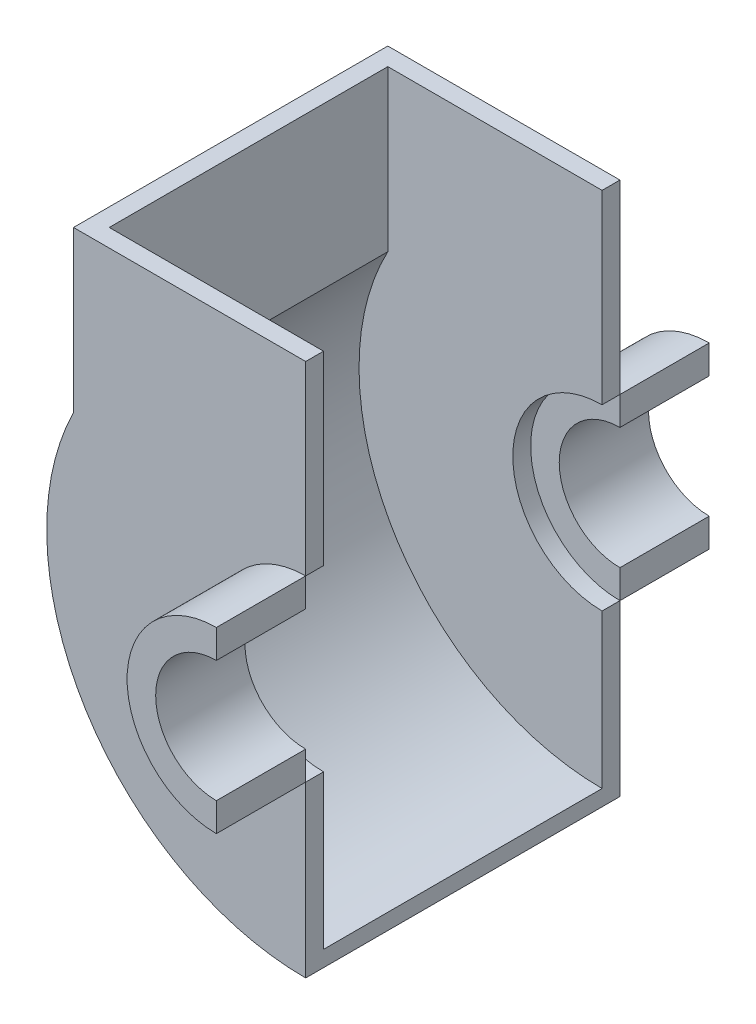
ISO-10303-21;
HEADER;
FILE_DESCRIPTION(('STEP AP214'),'2;1');
FILE_NAME('part.step','',(''),(''),'','','');
FILE_SCHEMA(('AUTOMOTIVE_DESIGN { 1 0 10303 214 1 1 1 1 }'));
ENDSEC;
DATA;
#1=APPLICATION_CONTEXT('core data for automotive mechanical design processes');
#2=APPLICATION_PROTOCOL_DEFINITION('international standard','automotive_design',2000,#1);
#3=PRODUCT_CONTEXT('',#1,'mechanical');
#4=PRODUCT('Part','Part','',(#3));
#5=PRODUCT_RELATED_PRODUCT_CATEGORY('part','',(#4));
#6=PRODUCT_DEFINITION_FORMATION('','',#4);
#7=PRODUCT_DEFINITION_CONTEXT('part definition',#1,'design');
#8=PRODUCT_DEFINITION('design','',#6,#7);
#9=PRODUCT_DEFINITION_SHAPE('','',#8);
#10=(LENGTH_UNIT() NAMED_UNIT(*) SI_UNIT(.MILLI.,.METRE.));
#11=(NAMED_UNIT(*) PLANE_ANGLE_UNIT() SI_UNIT($,.RADIAN.));
#12=(NAMED_UNIT(*) SI_UNIT($,.STERADIAN.) SOLID_ANGLE_UNIT());
#13=UNCERTAINTY_MEASURE_WITH_UNIT(LENGTH_MEASURE(1.E-05),#10,'distance_accuracy_value','');
#14=(GEOMETRIC_REPRESENTATION_CONTEXT(3) GLOBAL_UNCERTAINTY_ASSIGNED_CONTEXT((#13)) GLOBAL_UNIT_ASSIGNED_CONTEXT((#10,
#11,#12)) REPRESENTATION_CONTEXT('',''));
#15=CARTESIAN_POINT('',(0.,0.,0.));
#16=DIRECTION('',(0.,0.,1.));
#17=DIRECTION('',(1.,0.,0.));
#18=AXIS2_PLACEMENT_3D('',#15,#16,#17);
#19=CARTESIAN_POINT('',(9.63648849520705E-13,0.,133.));
#20=DIRECTION('',(0.,0.,-1.));
#21=DIRECTION('',(1.,0.,0.));
#22=AXIS2_PLACEMENT_3D('',#19,#20,#21);
#23=CYLINDRICAL_SURFACE('',#22,25.);
#24=DIRECTION('',(0.,0.,-1.));
#25=VECTOR('',#24,1.);
#26=CARTESIAN_POINT('',(9.63648849520705E-13,-25.,133.));
#27=LINE('',#26,#25);
#28=CARTESIAN_POINT('',(9.63648849520705E-13,-25.,133.));
#29=VERTEX_POINT('',#28);
#30=CARTESIAN_POINT('',(6.14500715636392E-13,-25.,108.));
#31=VERTEX_POINT('',#30);
#32=EDGE_CURVE('E51',#29,#31,#27,.T.);
#33=ORIENTED_EDGE('',*,*,#32,.F.);
#34=CARTESIAN_POINT('',(9.63648849520705E-13,0.,133.));
#35=DIRECTION('',(0.,0.,1.));
#36=DIRECTION('',(1.,0.,0.));
#37=AXIS2_PLACEMENT_3D('',#34,#35,#36);
#38=CIRCLE('',#37,25.);
#39=CARTESIAN_POINT('',(9.63648849520705E-13,25.,133.));
#40=VERTEX_POINT('',#39);
#41=EDGE_CURVE('E119',#40,#29,#38,.T.);
#42=ORIENTED_EDGE('',*,*,#41,.F.);
#43=DIRECTION('',(0.,0.,-1.));
#44=VECTOR('',#43,1.);
#45=CARTESIAN_POINT('',(9.63648849520705E-13,25.,133.));
#46=LINE('',#45,#44);
#47=CARTESIAN_POINT('',(6.14500715636392E-13,25.,108.));
#48=VERTEX_POINT('',#47);
#49=EDGE_CURVE('E12',#40,#48,#46,.T.);
#50=ORIENTED_EDGE('',*,*,#49,.T.);
#51=CARTESIAN_POINT('',(6.14500715636392E-13,0.,108.));
#52=DIRECTION('',(0.,0.,1.));
#53=DIRECTION('',(1.,0.,0.));
#54=AXIS2_PLACEMENT_3D('',#51,#52,#53);
#55=CIRCLE('',#54,25.);
#56=EDGE_CURVE('E94',#48,#31,#55,.T.);
#57=ORIENTED_EDGE('',*,*,#56,.T.);
#58=EDGE_LOOP('',(#33,#42,#50,#57));
#59=FACE_BOUND('',#58,.T.);
#60=ADVANCED_FACE('F48',(#59),#23,.T.);
#61=CARTESIAN_POINT('',(9.63648849520705E-13,25.,133.));
#62=DIRECTION('',(-1.,0.,0.));
#63=DIRECTION('',(0.,0.,-1.));
#64=AXIS2_PLACEMENT_3D('',#61,#62,#63);
#65=PLANE('',#64);
#66=ORIENTED_EDGE('',*,*,#49,.F.);
#67=DIRECTION('',(0.,-1.,0.));
#68=VECTOR('',#67,1.);
#69=CARTESIAN_POINT('',(9.63648849520705E-13,25.,133.));
#70=LINE('',#69,#68);
#71=CARTESIAN_POINT('',(9.63648849520705E-13,17.,133.));
#72=VERTEX_POINT('',#71);
#73=EDGE_CURVE('E64',#40,#72,#70,.T.);
#74=ORIENTED_EDGE('',*,*,#73,.T.);
#75=DIRECTION('',(0.,0.,-1.));
#76=VECTOR('',#75,1.);
#77=CARTESIAN_POINT('',(9.63648849520705E-13,17.,133.));
#78=LINE('',#77,#76);
#79=CARTESIAN_POINT('',(6.14500715636392E-13,17.,108.));
#80=VERTEX_POINT('',#79);
#81=EDGE_CURVE('E56',#72,#80,#78,.T.);
#82=ORIENTED_EDGE('',*,*,#81,.T.);
#83=DIRECTION('',(0.,-1.,0.));
#84=VECTOR('',#83,1.);
#85=CARTESIAN_POINT('',(6.14500715636392E-13,25.,108.));
#86=LINE('',#85,#84);
#87=EDGE_CURVE('E115',#48,#80,#86,.T.);
#88=ORIENTED_EDGE('',*,*,#87,.F.);
#89=EDGE_LOOP('',(#66,#74,#82,#88));
#90=FACE_BOUND('',#89,.T.);
#91=ADVANCED_FACE('F114',(#90),#65,.F.);
#92=CARTESIAN_POINT('',(9.63648849520705E-13,0.,133.));
#93=DIRECTION('',(0.,0.,-1.));
#94=DIRECTION('',(1.,0.,0.));
#95=AXIS2_PLACEMENT_3D('',#92,#93,#94);
#96=CYLINDRICAL_SURFACE('',#95,17.);
#97=ORIENTED_EDGE('',*,*,#81,.F.);
#98=CARTESIAN_POINT('',(9.63648849520705E-13,0.,133.));
#99=DIRECTION('',(0.,0.,1.));
#100=DIRECTION('',(1.,0.,0.));
#101=AXIS2_PLACEMENT_3D('',#98,#99,#100);
#102=CIRCLE('',#101,17.);
#103=CARTESIAN_POINT('',(9.60526000182879E-13,-17.,133.));
#104=VERTEX_POINT('',#103);
#105=EDGE_CURVE('E69',#72,#104,#102,.T.);
#106=ORIENTED_EDGE('',*,*,#105,.T.);
#107=DIRECTION('',(0.,0.,-1.));
#108=VECTOR('',#107,1.);
#109=CARTESIAN_POINT('',(9.60526000182879E-13,-17.,133.));
#110=LINE('',#109,#108);
#111=CARTESIAN_POINT('',(6.11377866298566E-13,-17.,108.));
#112=VERTEX_POINT('',#111);
#113=EDGE_CURVE('E107',#104,#112,#110,.T.);
#114=ORIENTED_EDGE('',*,*,#113,.T.);
#115=CARTESIAN_POINT('',(6.14500715636392E-13,0.,108.));
#116=DIRECTION('',(0.,0.,1.));
#117=DIRECTION('',(1.,0.,0.));
#118=AXIS2_PLACEMENT_3D('',#115,#116,#117);
#119=CIRCLE('',#118,17.);
#120=EDGE_CURVE('E95',#80,#112,#119,.T.);
#121=ORIENTED_EDGE('',*,*,#120,.F.);
#122=EDGE_LOOP('',(#97,#106,#114,#121));
#123=FACE_BOUND('',#122,.T.);
#124=ADVANCED_FACE('F117',(#123),#96,.F.);
#125=CARTESIAN_POINT('',(9.63648849520705E-13,-17.,133.));
#126=DIRECTION('',(-1.,0.,0.));
#127=DIRECTION('',(0.,0.,-1.));
#128=AXIS2_PLACEMENT_3D('',#125,#126,#127);
#129=PLANE('',#128);
#130=ORIENTED_EDGE('',*,*,#113,.F.);
#131=DIRECTION('',(0.,-1.,0.));
#132=VECTOR('',#131,1.);
#133=CARTESIAN_POINT('',(9.63648849520705E-13,-17.,133.));
#134=LINE('',#133,#132);
#135=EDGE_CURVE('E106',#104,#29,#134,.T.);
#136=ORIENTED_EDGE('',*,*,#135,.T.);
#137=ORIENTED_EDGE('',*,*,#32,.T.);
#138=DIRECTION('',(0.,-1.,0.));
#139=VECTOR('',#138,1.);
#140=CARTESIAN_POINT('',(6.14500715636392E-13,-17.,108.));
#141=LINE('',#140,#139);
#142=EDGE_CURVE('E90',#112,#31,#141,.T.);
#143=ORIENTED_EDGE('',*,*,#142,.F.);
#144=EDGE_LOOP('',(#130,#136,#137,#143));
#145=FACE_BOUND('',#144,.T.);
#146=ADVANCED_FACE('F105',(#145),#129,.F.);
#147=CARTESIAN_POINT('',(9.63648849520705E-13,0.,133.));
#148=DIRECTION('',(0.,0.,-1.));
#149=DIRECTION('',(1.,0.,0.));
#150=AXIS2_PLACEMENT_3D('',#147,#148,#149);
#151=PLANE('',#150);
#152=ORIENTED_EDGE('',*,*,#41,.T.);
#153=ORIENTED_EDGE('',*,*,#135,.F.);
#154=ORIENTED_EDGE('',*,*,#105,.F.);
#155=ORIENTED_EDGE('',*,*,#73,.F.);
#156=EDGE_LOOP('',(#152,#153,#154,#155));
#157=FACE_BOUND('',#156,.T.);
#158=ADVANCED_FACE('F122',(#157),#151,.F.);
#159=CARTESIAN_POINT('',(6.14500715636392E-13,0.,108.));
#160=DIRECTION('',(0.,0.,-1.));
#161=DIRECTION('',(1.,0.,0.));
#162=AXIS2_PLACEMENT_3D('',#159,#160,#161);
#163=PLANE('',#162);
#164=ORIENTED_EDGE('',*,*,#56,.F.);
#165=ORIENTED_EDGE('',*,*,#87,.T.);
#166=ORIENTED_EDGE('',*,*,#120,.T.);
#167=ORIENTED_EDGE('',*,*,#142,.T.);
#168=EDGE_LOOP('',(#164,#165,#166,#167));
#169=FACE_BOUND('',#168,.T.);
#170=ADVANCED_FACE('F92',(#169),#163,.T.);
#171=CLOSED_SHELL('',(#60,#91,#124,#146,#158,#170));
#172=MANIFOLD_SOLID_BREP('B2',#171);
#173=CARTESIAN_POINT('',(-65.,0.,25.));
#174=DIRECTION('',(1.,0.,0.));
#175=DIRECTION('',(0.,1.,0.));
#176=AXIS2_PLACEMENT_3D('',#173,#174,#175);
#177=PLANE('',#176);
#178=DIRECTION('',(0.,-1.,0.));
#179=VECTOR('',#178,1.);
#180=CARTESIAN_POINT('',(-65.,0.,20.));
#181=LINE('',#180,#179);
#182=CARTESIAN_POINT('',(-65.,77.,20.));
#183=VERTEX_POINT('',#182);
#184=CARTESIAN_POINT('',(-65.,32.1130814466628,20.));
#185=VERTEX_POINT('',#184);
#186=EDGE_CURVE('E314',#183,#185,#181,.T.);
#187=ORIENTED_EDGE('',*,*,#186,.T.);
#188=DIRECTION('',(0.,0.,-1.));
#189=VECTOR('',#188,1.);
#190=CARTESIAN_POINT('',(-65.,32.1130814466628,25.));
#191=LINE('',#190,#189);
#192=CARTESIAN_POINT('',(-64.9999999999994,32.1130814466628,108.000000000001));
#193=VERTEX_POINT('',#192);
#194=EDGE_CURVE('E46',#193,#185,#191,.T.);
#195=ORIENTED_EDGE('',*,*,#194,.F.);
#196=DIRECTION('',(0.,-1.,0.));
#197=VECTOR('',#196,1.);
#198=CARTESIAN_POINT('',(-64.9999999999994,0.,108.000000000001));
#199=LINE('',#198,#197);
#200=CARTESIAN_POINT('',(-64.9999999999994,77.,108.000000000001));
#201=VERTEX_POINT('',#200);
#202=EDGE_CURVE('E517',#201,#193,#199,.T.);
#203=ORIENTED_EDGE('',*,*,#202,.F.);
#204=DIRECTION('',(0.,0.,-1.));
#205=VECTOR('',#204,1.);
#206=CARTESIAN_POINT('',(-65.,77.,25.));
#207=LINE('',#206,#205);
#208=EDGE_CURVE('E324',#201,#183,#207,.T.);
#209=ORIENTED_EDGE('',*,*,#208,.T.);
#210=EDGE_LOOP('',(#187,#195,#203,#209));
#211=FACE_BOUND('',#210,.T.);
#212=ADVANCED_FACE('F181',(#211),#177,.F.);
#213=CARTESIAN_POINT('',(0.,0.,25.));
#214=DIRECTION('',(0.,0.,-1.));
#215=DIRECTION('',(-1.,0.,0.));
#216=AXIS2_PLACEMENT_3D('',#213,#214,#215);
#217=CYLINDRICAL_SURFACE('',#216,72.5);
#218=CARTESIAN_POINT('',(0.,0.,20.));
#219=DIRECTION('',(0.,0.,1.));
#220=DIRECTION('',(1.,0.,0.));
#221=AXIS2_PLACEMENT_3D('',#218,#219,#220);
#222=CIRCLE('',#221,72.5);
#223=CARTESIAN_POINT('',(0.,-72.5,20.));
#224=VERTEX_POINT('',#223);
#225=EDGE_CURVE('E327',#185,#224,#222,.T.);
#226=ORIENTED_EDGE('',*,*,#225,.T.);
#227=DIRECTION('',(0.,0.,-1.));
#228=VECTOR('',#227,1.);
#229=CARTESIAN_POINT('',(0.,-72.5,25.));
#230=LINE('',#229,#228);
#231=CARTESIAN_POINT('',(6.14500715636392E-13,-72.5,108.));
#232=VERTEX_POINT('',#231);
#233=EDGE_CURVE('E188',#232,#224,#230,.T.);
#234=ORIENTED_EDGE('',*,*,#233,.F.);
#235=CARTESIAN_POINT('',(6.14500715636392E-13,0.,108.));
#236=DIRECTION('',(0.,0.,1.));
#237=DIRECTION('',(1.,0.,0.));
#238=AXIS2_PLACEMENT_3D('',#235,#236,#237);
#239=CIRCLE('',#238,72.5);
#240=EDGE_CURVE('E518',#193,#232,#239,.T.);
#241=ORIENTED_EDGE('',*,*,#240,.F.);
#242=ORIENTED_EDGE('',*,*,#194,.T.);
#243=EDGE_LOOP('',(#226,#234,#241,#242));
#244=FACE_BOUND('',#243,.T.);
#245=ADVANCED_FACE('F388',(#244),#217,.T.);
#246=CARTESIAN_POINT('',(0.,0.,25.));
#247=DIRECTION('',(-1.,0.,0.));
#248=DIRECTION('',(0.,0.,1.));
#249=AXIS2_PLACEMENT_3D('',#246,#247,#248);
#250=PLANE('',#249);
#251=DIRECTION('',(0.,1.,0.));
#252=VECTOR('',#251,1.);
#253=CARTESIAN_POINT('',(0.,0.,25.));
#254=LINE('',#253,#252);
#255=CARTESIAN_POINT('',(0.,-68.053287944081,25.));
#256=VERTEX_POINT('',#255);
#257=CARTESIAN_POINT('',(0.,-25.,25.));
#258=VERTEX_POINT('',#257);
#259=EDGE_CURVE('E315',#256,#258,#254,.T.);
#260=ORIENTED_EDGE('',*,*,#259,.F.);
#261=DIRECTION('',(0.,0.,1.));
#262=VECTOR('',#261,1.);
#263=CARTESIAN_POINT('',(1.43849031160337E-12,-68.053287944081,-146.152038807835));
#264=LINE('',#263,#262);
#265=CARTESIAN_POINT('',(5.44671088859529E-13,-68.053287944081,103.));
#266=VERTEX_POINT('',#265);
#267=EDGE_CURVE('E276',#256,#266,#264,.T.);
#268=ORIENTED_EDGE('',*,*,#267,.T.);
#269=DIRECTION('',(0.,1.,0.));
#270=VECTOR('',#269,1.);
#271=CARTESIAN_POINT('',(5.44671088859529E-13,0.,103.));
#272=LINE('',#271,#270);
#273=CARTESIAN_POINT('',(5.44671088859529E-13,-25.,103.));
#274=VERTEX_POINT('',#273);
#275=EDGE_CURVE('E268',#266,#274,#272,.T.);
#276=ORIENTED_EDGE('',*,*,#275,.T.);
#277=DIRECTION('',(0.,0.,1.));
#278=VECTOR('',#277,1.);
#279=CARTESIAN_POINT('',(5.44671088859529E-13,-25.,103.));
#280=LINE('',#279,#278);
#281=CARTESIAN_POINT('',(6.14500715636392E-13,-25.,108.));
#282=VERTEX_POINT('',#281);
#283=EDGE_CURVE('E273',#274,#282,#280,.T.);
#284=ORIENTED_EDGE('',*,*,#283,.T.);
#285=DIRECTION('',(0.,1.,0.));
#286=VECTOR('',#285,1.);
#287=CARTESIAN_POINT('',(6.14500715636392E-13,0.,108.));
#288=LINE('',#287,#286);
#289=EDGE_CURVE('E349',#232,#282,#288,.T.);
#290=ORIENTED_EDGE('',*,*,#289,.F.);
#291=ORIENTED_EDGE('',*,*,#233,.T.);
#292=DIRECTION('',(0.,1.,0.));
#293=VECTOR('',#292,1.);
#294=CARTESIAN_POINT('',(0.,0.,20.));
#295=LINE('',#294,#293);
#296=CARTESIAN_POINT('',(0.,-25.,20.));
#297=VERTEX_POINT('',#296);
#298=EDGE_CURVE('E329',#224,#297,#295,.T.);
#299=ORIENTED_EDGE('',*,*,#298,.T.);
#300=DIRECTION('',(0.,0.,-1.));
#301=VECTOR('',#300,1.);
#302=CARTESIAN_POINT('',(0.,-25.,25.));
#303=LINE('',#302,#301);
#304=EDGE_CURVE('E344',#258,#297,#303,.T.);
#305=ORIENTED_EDGE('',*,*,#304,.F.);
#306=EDGE_LOOP('',(#260,#268,#276,#284,#290,#291,#299,#305));
#307=FACE_BOUND('',#306,.T.);
#308=ADVANCED_FACE('F270',(#307),#250,.F.);
#309=CARTESIAN_POINT('',(0.,0.,25.));
#310=DIRECTION('',(0.,0.,-1.));
#311=DIRECTION('',(-1.,0.,0.));
#312=AXIS2_PLACEMENT_3D('',#309,#310,#311);
#313=CYLINDRICAL_SURFACE('',#312,25.);
#314=CARTESIAN_POINT('',(0.,0.,20.));
#315=DIRECTION('',(0.,0.,1.));
#316=DIRECTION('',(1.,0.,0.));
#317=AXIS2_PLACEMENT_3D('',#314,#315,#316);
#318=CIRCLE('',#317,25.);
#319=CARTESIAN_POINT('',(0.,25.,20.));
#320=VERTEX_POINT('',#319);
#321=EDGE_CURVE('E331',#320,#297,#318,.T.);
#322=ORIENTED_EDGE('',*,*,#321,.F.);
#323=DIRECTION('',(0.,0.,-1.));
#324=VECTOR('',#323,1.);
#325=CARTESIAN_POINT('',(0.,25.,25.));
#326=LINE('',#325,#324);
#327=CARTESIAN_POINT('',(0.,25.,25.));
#328=VERTEX_POINT('',#327);
#329=EDGE_CURVE('E342',#328,#320,#326,.T.);
#330=ORIENTED_EDGE('',*,*,#329,.F.);
#331=CARTESIAN_POINT('',(0.,0.,25.));
#332=DIRECTION('',(0.,0.,1.));
#333=DIRECTION('',(1.,0.,0.));
#334=AXIS2_PLACEMENT_3D('',#331,#332,#333);
#335=CIRCLE('',#334,25.);
#336=EDGE_CURVE('E317',#328,#258,#335,.T.);
#337=ORIENTED_EDGE('',*,*,#336,.T.);
#338=ORIENTED_EDGE('',*,*,#304,.T.);
#339=EDGE_LOOP('',(#322,#330,#337,#338));
#340=FACE_BOUND('',#339,.T.);
#341=ADVANCED_FACE('F360',(#340),#313,.F.);
#342=CARTESIAN_POINT('',(0.,0.,25.));
#343=DIRECTION('',(-1.,0.,0.));
#344=DIRECTION('',(0.,-1.,0.));
#345=AXIS2_PLACEMENT_3D('',#342,#343,#344);
#346=PLANE('',#345);
#347=DIRECTION('',(0.,1.,0.));
#348=VECTOR('',#347,1.);
#349=CARTESIAN_POINT('',(0.,0.,20.));
#350=LINE('',#349,#348);
#351=CARTESIAN_POINT('',(1.29251953409097E-13,77.,20.));
#352=VERTEX_POINT('',#351);
#353=EDGE_CURVE('E334',#320,#352,#350,.T.);
#354=ORIENTED_EDGE('',*,*,#353,.T.);
#355=DIRECTION('',(0.,0.,-1.));
#356=VECTOR('',#355,1.);
#357=CARTESIAN_POINT('',(1.29251953409097E-13,77.,25.));
#358=LINE('',#357,#356);
#359=CARTESIAN_POINT('',(1.29251953409097E-13,77.,25.));
#360=VERTEX_POINT('',#359);
#361=EDGE_CURVE('E339',#360,#352,#358,.T.);
#362=ORIENTED_EDGE('',*,*,#361,.F.);
#363=DIRECTION('',(0.,1.,0.));
#364=VECTOR('',#363,1.);
#365=CARTESIAN_POINT('',(0.,0.,25.));
#366=LINE('',#365,#364);
#367=EDGE_CURVE('E321',#328,#360,#366,.T.);
#368=ORIENTED_EDGE('',*,*,#367,.F.);
#369=ORIENTED_EDGE('',*,*,#329,.T.);
#370=EDGE_LOOP('',(#354,#362,#368,#369));
#371=FACE_BOUND('',#370,.T.);
#372=ADVANCED_FACE('F384',(#371),#346,.F.);
#373=CARTESIAN_POINT('',(0.,77.,25.));
#374=DIRECTION('',(0.,-1.,0.));
#375=DIRECTION('',(1.,0.,0.));
#376=AXIS2_PLACEMENT_3D('',#373,#374,#375);
#377=PLANE('',#376);
#378=ORIENTED_EDGE('',*,*,#208,.F.);
#379=DIRECTION('',(-1.,0.,0.));
#380=VECTOR('',#379,1.);
#381=CARTESIAN_POINT('',(5.98060874694827E-13,77.,108.));
#382=LINE('',#381,#380);
#383=CARTESIAN_POINT('',(7.43752669045488E-13,77.,108.));
#384=VERTEX_POINT('',#383);
#385=EDGE_CURVE('E280',#384,#201,#382,.T.);
#386=ORIENTED_EDGE('',*,*,#385,.F.);
#387=DIRECTION('',(0.,0.,1.));
#388=VECTOR('',#387,1.);
#389=CARTESIAN_POINT('',(6.73923042268626E-13,77.,103.));
#390=LINE('',#389,#388);
#391=CARTESIAN_POINT('',(6.73923042268626E-13,77.,103.));
#392=VERTEX_POINT('',#391);
#393=EDGE_CURVE('E298',#392,#384,#390,.T.);
#394=ORIENTED_EDGE('',*,*,#393,.F.);
#395=DIRECTION('',(-1.,0.,0.));
#396=VECTOR('',#395,1.);
#397=CARTESIAN_POINT('',(5.28231247917964E-13,77.,103.));
#398=LINE('',#397,#396);
#399=CARTESIAN_POINT('',(-60.0000000000005,77.,103.000000000001));
#400=VERTEX_POINT('',#399);
#401=EDGE_CURVE('E367',#392,#400,#398,.T.);
#402=ORIENTED_EDGE('',*,*,#401,.T.);
#403=DIRECTION('',(0.,0.,1.));
#404=VECTOR('',#403,1.);
#405=CARTESIAN_POINT('',(-60.0000000000005,77.,-146.152038807835));
#406=LINE('',#405,#404);
#407=CARTESIAN_POINT('',(-60.0000000000005,77.,25.));
#408=VERTEX_POINT('',#407);
#409=EDGE_CURVE('E306',#408,#400,#406,.T.);
#410=ORIENTED_EDGE('',*,*,#409,.F.);
#411=DIRECTION('',(-1.,0.,0.));
#412=VECTOR('',#411,1.);
#413=CARTESIAN_POINT('',(0.,77.,25.));
#414=LINE('',#413,#412);
#415=EDGE_CURVE('E195',#360,#408,#414,.T.);
#416=ORIENTED_EDGE('',*,*,#415,.F.);
#417=ORIENTED_EDGE('',*,*,#361,.T.);
#418=DIRECTION('',(-1.,0.,0.));
#419=VECTOR('',#418,1.);
#420=CARTESIAN_POINT('',(0.,77.,20.));
#421=LINE('',#420,#419);
#422=EDGE_CURVE('E318',#352,#183,#421,.T.);
#423=ORIENTED_EDGE('',*,*,#422,.T.);
#424=EDGE_LOOP('',(#378,#386,#394,#402,#410,#416,#417,#423));
#425=FACE_BOUND('',#424,.T.);
#426=ADVANCED_FACE('F372',(#425),#377,.F.);
#427=CARTESIAN_POINT('',(0.,0.,25.));
#428=DIRECTION('',(0.,0.,1.));
#429=DIRECTION('',(1.,0.,0.));
#430=AXIS2_PLACEMENT_3D('',#427,#428,#429);
#431=PLANE('',#430);
#432=ORIENTED_EDGE('',*,*,#415,.T.);
#433=DIRECTION('',(0.,-1.,0.));
#434=VECTOR('',#433,1.);
#435=CARTESIAN_POINT('',(-60.0000000000005,0.,25.));
#436=LINE('',#435,#434);
#437=CARTESIAN_POINT('',(-60.0000000000005,32.1130814466628,25.));
#438=VERTEX_POINT('',#437);
#439=EDGE_CURVE('E312',#408,#438,#436,.T.);
#440=ORIENTED_EDGE('',*,*,#439,.T.);
#441=CARTESIAN_POINT('',(-4.46909611371921E-13,0.,25.));
#442=DIRECTION('',(0.,0.,1.));
#443=DIRECTION('',(1.,0.,0.));
#444=AXIS2_PLACEMENT_3D('',#441,#442,#443);
#445=CIRCLE('',#444,68.053287944081);
#446=EDGE_CURVE('E201',#256,#438,#445,.F.);
#447=ORIENTED_EDGE('',*,*,#446,.F.);
#448=ORIENTED_EDGE('',*,*,#259,.T.);
#449=ORIENTED_EDGE('',*,*,#336,.F.);
#450=ORIENTED_EDGE('',*,*,#367,.T.);
#451=EDGE_LOOP('',(#432,#440,#447,#448,#449,#450));
#452=FACE_BOUND('',#451,.T.);
#453=ADVANCED_FACE('F376',(#452),#431,.T.);
#454=CARTESIAN_POINT('',(0.,0.,20.));
#455=DIRECTION('',(0.,0.,1.));
#456=DIRECTION('',(1.,0.,0.));
#457=AXIS2_PLACEMENT_3D('',#454,#455,#456);
#458=PLANE('',#457);
#459=ORIENTED_EDGE('',*,*,#186,.F.);
#460=ORIENTED_EDGE('',*,*,#422,.F.);
#461=ORIENTED_EDGE('',*,*,#353,.F.);
#462=ORIENTED_EDGE('',*,*,#321,.T.);
#463=ORIENTED_EDGE('',*,*,#298,.F.);
#464=ORIENTED_EDGE('',*,*,#225,.F.);
#465=EDGE_LOOP('',(#459,#460,#461,#462,#463,#464));
#466=FACE_BOUND('',#465,.T.);
#467=ADVANCED_FACE('F355',(#466),#458,.F.);
#468=CARTESIAN_POINT('',(-60.0000000000005,77.,-146.152038807835));
#469=DIRECTION('',(-1.,0.,0.));
#470=DIRECTION('',(0.,-1.,0.));
#471=AXIS2_PLACEMENT_3D('',#468,#469,#470);
#472=PLANE('',#471);
#473=ORIENTED_EDGE('',*,*,#439,.F.);
#474=ORIENTED_EDGE('',*,*,#409,.T.);
#475=DIRECTION('',(0.,-1.,0.));
#476=VECTOR('',#475,1.);
#477=CARTESIAN_POINT('',(-60.0000000000005,77.,103.));
#478=LINE('',#477,#476);
#479=CARTESIAN_POINT('',(-60.0000000000005,32.1130814466628,103.));
#480=VERTEX_POINT('',#479);
#481=EDGE_CURVE('E296',#400,#480,#478,.T.);
#482=ORIENTED_EDGE('',*,*,#481,.T.);
#483=DIRECTION('',(0.,0.,1.));
#484=VECTOR('',#483,1.);
#485=CARTESIAN_POINT('',(-60.0000000000005,32.1130814466628,-146.152038807835));
#486=LINE('',#485,#484);
#487=EDGE_CURVE('E304',#438,#480,#486,.T.);
#488=ORIENTED_EDGE('',*,*,#487,.F.);
#489=EDGE_LOOP('',(#473,#474,#482,#488));
#490=FACE_BOUND('',#489,.T.);
#491=ADVANCED_FACE('F375',(#490),#472,.F.);
#492=CARTESIAN_POINT('',(-4.46909611371921E-13,0.,-146.152038807835));
#493=DIRECTION('',(0.,0.,1.));
#494=DIRECTION('',(1.,0.,0.));
#495=AXIS2_PLACEMENT_3D('',#492,#493,#494);
#496=CYLINDRICAL_SURFACE('',#495,68.053287944081);
#497=ORIENTED_EDGE('',*,*,#267,.F.);
#498=ORIENTED_EDGE('',*,*,#446,.T.);
#499=ORIENTED_EDGE('',*,*,#487,.T.);
#500=CARTESIAN_POINT('',(-4.46909611371921E-13,0.,103.));
#501=DIRECTION('',(0.,0.,-1.));
#502=DIRECTION('',(-1.,0.,0.));
#503=AXIS2_PLACEMENT_3D('',#500,#501,#502);
#504=CIRCLE('',#503,68.053287944081);
#505=EDGE_CURVE('E293',#266,#480,#504,.T.);
#506=ORIENTED_EDGE('',*,*,#505,.F.);
#507=EDGE_LOOP('',(#497,#498,#499,#506));
#508=FACE_BOUND('',#507,.T.);
#509=ADVANCED_FACE('F364',(#508),#496,.F.);
#510=CARTESIAN_POINT('',(5.44671088859529E-13,0.,103.));
#511=DIRECTION('',(0.,0.,1.));
#512=DIRECTION('',(-1.,0.,0.));
#513=AXIS2_PLACEMENT_3D('',#510,#511,#512);
#514=CYLINDRICAL_SURFACE('',#513,25.);
#515=CARTESIAN_POINT('',(6.14500715636392E-13,0.,108.));
#516=DIRECTION('',(0.,0.,1.));
#517=DIRECTION('',(1.,0.,0.));
#518=AXIS2_PLACEMENT_3D('',#515,#516,#517);
#519=CIRCLE('',#518,25.);
#520=CARTESIAN_POINT('',(6.14500715636392E-13,25.,108.));
#521=VERTEX_POINT('',#520);
#522=EDGE_CURVE('E292',#521,#282,#519,.T.);
#523=ORIENTED_EDGE('',*,*,#522,.T.);
#524=ORIENTED_EDGE('',*,*,#283,.F.);
#525=CARTESIAN_POINT('',(5.44671088859529E-13,0.,103.));
#526=DIRECTION('',(0.,0.,1.));
#527=DIRECTION('',(1.,0.,0.));
#528=AXIS2_PLACEMENT_3D('',#525,#526,#527);
#529=CIRCLE('',#528,25.);
#530=CARTESIAN_POINT('',(5.44671088859529E-13,25.,103.));
#531=VERTEX_POINT('',#530);
#532=EDGE_CURVE('E279',#531,#274,#529,.T.);
#533=ORIENTED_EDGE('',*,*,#532,.F.);
#534=DIRECTION('',(0.,0.,1.));
#535=VECTOR('',#534,1.);
#536=CARTESIAN_POINT('',(5.44671088859529E-13,25.,103.));
#537=LINE('',#536,#535);
#538=EDGE_CURVE('E294',#531,#521,#537,.T.);
#539=ORIENTED_EDGE('',*,*,#538,.T.);
#540=EDGE_LOOP('',(#523,#524,#533,#539));
#541=FACE_BOUND('',#540,.T.);
#542=ADVANCED_FACE('F290',(#541),#514,.F.);
#543=CARTESIAN_POINT('',(5.44671088859529E-13,0.,103.));
#544=DIRECTION('',(-1.,0.,0.));
#545=DIRECTION('',(0.,-1.,0.));
#546=AXIS2_PLACEMENT_3D('',#543,#544,#545);
#547=PLANE('',#546);
#548=DIRECTION('',(0.,1.,0.));
#549=VECTOR('',#548,1.);
#550=CARTESIAN_POINT('',(6.14500715636392E-13,0.,108.));
#551=LINE('',#550,#549);
#552=EDGE_CURVE('E526',#521,#384,#551,.T.);
#553=ORIENTED_EDGE('',*,*,#552,.F.);
#554=ORIENTED_EDGE('',*,*,#538,.F.);
#555=DIRECTION('',(0.,1.,0.));
#556=VECTOR('',#555,1.);
#557=CARTESIAN_POINT('',(5.44671088859529E-13,0.,103.));
#558=LINE('',#557,#556);
#559=EDGE_CURVE('E285',#531,#392,#558,.T.);
#560=ORIENTED_EDGE('',*,*,#559,.T.);
#561=ORIENTED_EDGE('',*,*,#393,.T.);
#562=EDGE_LOOP('',(#553,#554,#560,#561));
#563=FACE_BOUND('',#562,.T.);
#564=ADVANCED_FACE('F470',(#563),#547,.F.);
#565=CARTESIAN_POINT('',(5.44671088859529E-13,0.,103.));
#566=DIRECTION('',(0.,0.,-1.));
#567=DIRECTION('',(1.,0.,0.));
#568=AXIS2_PLACEMENT_3D('',#565,#566,#567);
#569=PLANE('',#568);
#570=ORIENTED_EDGE('',*,*,#275,.F.);
#571=ORIENTED_EDGE('',*,*,#505,.T.);
#572=ORIENTED_EDGE('',*,*,#481,.F.);
#573=ORIENTED_EDGE('',*,*,#401,.F.);
#574=ORIENTED_EDGE('',*,*,#559,.F.);
#575=ORIENTED_EDGE('',*,*,#532,.T.);
#576=EDGE_LOOP('',(#570,#571,#572,#573,#574,#575));
#577=FACE_BOUND('',#576,.T.);
#578=ADVANCED_FACE('F283',(#577),#569,.T.);
#579=CARTESIAN_POINT('',(6.14500715636392E-13,0.,108.));
#580=DIRECTION('',(0.,0.,-1.));
#581=DIRECTION('',(1.,0.,0.));
#582=AXIS2_PLACEMENT_3D('',#579,#580,#581);
#583=PLANE('',#582);
#584=ORIENTED_EDGE('',*,*,#202,.T.);
#585=ORIENTED_EDGE('',*,*,#240,.T.);
#586=ORIENTED_EDGE('',*,*,#289,.T.);
#587=ORIENTED_EDGE('',*,*,#522,.F.);
#588=ORIENTED_EDGE('',*,*,#552,.T.);
#589=ORIENTED_EDGE('',*,*,#385,.T.);
#590=EDGE_LOOP('',(#584,#585,#586,#587,#588,#589));
#591=FACE_BOUND('',#590,.T.);
#592=ADVANCED_FACE('F489',(#591),#583,.F.);
#593=CLOSED_SHELL('',(#212,#245,#308,#341,#372,#426,#453,#467,#491,#509,#542,#564,#578,#592));
#594=MANIFOLD_SOLID_BREP('B6',#593);
#595=CARTESIAN_POINT('',(0.,0.,-5.));
#596=DIRECTION('',(0.,0.,1.));
#597=DIRECTION('',(1.,0.,0.));
#598=AXIS2_PLACEMENT_3D('',#595,#596,#597);
#599=CYLINDRICAL_SURFACE('',#598,25.);
#600=DIRECTION('',(0.,0.,1.));
#601=VECTOR('',#600,1.);
#602=CARTESIAN_POINT('',(0.,-25.,-5.));
#603=LINE('',#602,#601);
#604=CARTESIAN_POINT('',(0.,-25.,-5.));
#605=VERTEX_POINT('',#604);
#606=CARTESIAN_POINT('',(0.,-25.,20.));
#607=VERTEX_POINT('',#606);
#608=EDGE_CURVE('E546',#605,#607,#603,.T.);
#609=ORIENTED_EDGE('',*,*,#608,.T.);
#610=CARTESIAN_POINT('',(0.,0.,20.));
#611=DIRECTION('',(0.,0.,1.));
#612=DIRECTION('',(1.,0.,0.));
#613=AXIS2_PLACEMENT_3D('',#610,#611,#612);
#614=CIRCLE('',#613,25.);
#615=CARTESIAN_POINT('',(0.,25.,20.));
#616=VERTEX_POINT('',#615);
#617=EDGE_CURVE('E583',#616,#607,#614,.T.);
#618=ORIENTED_EDGE('',*,*,#617,.F.);
#619=DIRECTION('',(0.,0.,1.));
#620=VECTOR('',#619,1.);
#621=CARTESIAN_POINT('',(0.,25.,-5.));
#622=LINE('',#621,#620);
#623=CARTESIAN_POINT('',(0.,25.,-5.));
#624=VERTEX_POINT('',#623);
#625=EDGE_CURVE('E179',#624,#616,#622,.T.);
#626=ORIENTED_EDGE('',*,*,#625,.F.);
#627=CARTESIAN_POINT('',(0.,0.,-5.));
#628=DIRECTION('',(0.,0.,1.));
#629=DIRECTION('',(1.,0.,0.));
#630=AXIS2_PLACEMENT_3D('',#627,#628,#629);
#631=CIRCLE('',#630,25.);
#632=EDGE_CURVE('E585',#624,#605,#631,.T.);
#633=ORIENTED_EDGE('',*,*,#632,.T.);
#634=EDGE_LOOP('',(#609,#618,#626,#633));
#635=FACE_BOUND('',#634,.T.);
#636=ADVANCED_FACE('F543',(#635),#599,.T.);
#637=CARTESIAN_POINT('',(0.,25.,-5.));
#638=DIRECTION('',(-1.,0.,0.));
#639=DIRECTION('',(0.,0.,1.));
#640=AXIS2_PLACEMENT_3D('',#637,#638,#639);
#641=PLANE('',#640);
#642=ORIENTED_EDGE('',*,*,#625,.T.);
#643=DIRECTION('',(0.,-1.,0.));
#644=VECTOR('',#643,1.);
#645=CARTESIAN_POINT('',(0.,25.,20.));
#646=LINE('',#645,#644);
#647=CARTESIAN_POINT('',(0.,17.,20.));
#648=VERTEX_POINT('',#647);
#649=EDGE_CURVE('E597',#616,#648,#646,.T.);
#650=ORIENTED_EDGE('',*,*,#649,.T.);
#651=DIRECTION('',(0.,0.,1.));
#652=VECTOR('',#651,1.);
#653=CARTESIAN_POINT('',(0.,17.,-5.));
#654=LINE('',#653,#652);
#655=CARTESIAN_POINT('',(0.,17.,-5.));
#656=VERTEX_POINT('',#655);
#657=EDGE_CURVE('E551',#656,#648,#654,.T.);
#658=ORIENTED_EDGE('',*,*,#657,.F.);
#659=DIRECTION('',(0.,-1.,0.));
#660=VECTOR('',#659,1.);
#661=CARTESIAN_POINT('',(0.,25.,-5.));
#662=LINE('',#661,#660);
#663=EDGE_CURVE('E564',#624,#656,#662,.T.);
#664=ORIENTED_EDGE('',*,*,#663,.F.);
#665=EDGE_LOOP('',(#642,#650,#658,#664));
#666=FACE_BOUND('',#665,.T.);
#667=ADVANCED_FACE('F616',(#666),#641,.F.);
#668=CARTESIAN_POINT('',(0.,0.,-5.));
#669=DIRECTION('',(0.,0.,1.));
#670=DIRECTION('',(1.,0.,0.));
#671=AXIS2_PLACEMENT_3D('',#668,#669,#670);
#672=CYLINDRICAL_SURFACE('',#671,17.);
#673=ORIENTED_EDGE('',*,*,#657,.T.);
#674=CARTESIAN_POINT('',(0.,0.,20.));
#675=DIRECTION('',(0.,0.,1.));
#676=DIRECTION('',(1.,0.,0.));
#677=AXIS2_PLACEMENT_3D('',#674,#675,#676);
#678=CIRCLE('',#677,17.);
#679=CARTESIAN_POINT('',(0.,-17.,20.));
#680=VERTEX_POINT('',#679);
#681=EDGE_CURVE('E601',#648,#680,#678,.T.);
#682=ORIENTED_EDGE('',*,*,#681,.T.);
#683=DIRECTION('',(0.,0.,1.));
#684=VECTOR('',#683,1.);
#685=CARTESIAN_POINT('',(0.,-17.,-5.));
#686=LINE('',#685,#684);
#687=CARTESIAN_POINT('',(0.,-17.,-5.));
#688=VERTEX_POINT('',#687);
#689=EDGE_CURVE('E589',#688,#680,#686,.T.);
#690=ORIENTED_EDGE('',*,*,#689,.F.);
#691=CARTESIAN_POINT('',(0.,0.,-5.));
#692=DIRECTION('',(0.,0.,1.));
#693=DIRECTION('',(1.,0.,0.));
#694=AXIS2_PLACEMENT_3D('',#691,#692,#693);
#695=CIRCLE('',#694,17.);
#696=EDGE_CURVE('E609',#656,#688,#695,.T.);
#697=ORIENTED_EDGE('',*,*,#696,.F.);
#698=EDGE_LOOP('',(#673,#682,#690,#697));
#699=FACE_BOUND('',#698,.T.);
#700=ADVANCED_FACE('F614',(#699),#672,.F.);
#701=CARTESIAN_POINT('',(0.,-17.,-5.));
#702=DIRECTION('',(-1.,0.,0.));
#703=DIRECTION('',(0.,0.,1.));
#704=AXIS2_PLACEMENT_3D('',#701,#702,#703);
#705=PLANE('',#704);
#706=ORIENTED_EDGE('',*,*,#689,.T.);
#707=DIRECTION('',(0.,-1.,0.));
#708=VECTOR('',#707,1.);
#709=CARTESIAN_POINT('',(0.,-17.,20.));
#710=LINE('',#709,#708);
#711=EDGE_CURVE('E594',#680,#607,#710,.T.);
#712=ORIENTED_EDGE('',*,*,#711,.T.);
#713=ORIENTED_EDGE('',*,*,#608,.F.);
#714=DIRECTION('',(0.,-1.,0.));
#715=VECTOR('',#714,1.);
#716=CARTESIAN_POINT('',(0.,-17.,-5.));
#717=LINE('',#716,#715);
#718=EDGE_CURVE('E607',#688,#605,#717,.T.);
#719=ORIENTED_EDGE('',*,*,#718,.F.);
#720=EDGE_LOOP('',(#706,#712,#713,#719));
#721=FACE_BOUND('',#720,.T.);
#722=ADVANCED_FACE('F599',(#721),#705,.F.);
#723=CARTESIAN_POINT('',(0.,0.,-5.));
#724=DIRECTION('',(0.,0.,1.));
#725=DIRECTION('',(1.,0.,0.));
#726=AXIS2_PLACEMENT_3D('',#723,#724,#725);
#727=PLANE('',#726);
#728=ORIENTED_EDGE('',*,*,#632,.F.);
#729=ORIENTED_EDGE('',*,*,#663,.T.);
#730=ORIENTED_EDGE('',*,*,#696,.T.);
#731=ORIENTED_EDGE('',*,*,#718,.T.);
#732=EDGE_LOOP('',(#728,#729,#730,#731));
#733=FACE_BOUND('',#732,.T.);
#734=ADVANCED_FACE('F617',(#733),#727,.F.);
#735=CARTESIAN_POINT('',(0.,0.,20.));
#736=DIRECTION('',(0.,0.,1.));
#737=DIRECTION('',(1.,0.,0.));
#738=AXIS2_PLACEMENT_3D('',#735,#736,#737);
#739=PLANE('',#738);
#740=ORIENTED_EDGE('',*,*,#617,.T.);
#741=ORIENTED_EDGE('',*,*,#711,.F.);
#742=ORIENTED_EDGE('',*,*,#681,.F.);
#743=ORIENTED_EDGE('',*,*,#649,.F.);
#744=EDGE_LOOP('',(#740,#741,#742,#743));
#745=FACE_BOUND('',#744,.T.);
#746=ADVANCED_FACE('F592',(#745),#739,.T.);
#747=CLOSED_SHELL('',(#636,#667,#700,#722,#734,#746));
#748=MANIFOLD_SOLID_BREP('B40',#747);
#749=ADVANCED_BREP_SHAPE_REPRESENTATION('',(#18,#172,#594,#748),#14);
#750=SHAPE_DEFINITION_REPRESENTATION(#9,#749);
ENDSEC;
END-ISO-10303-21;
